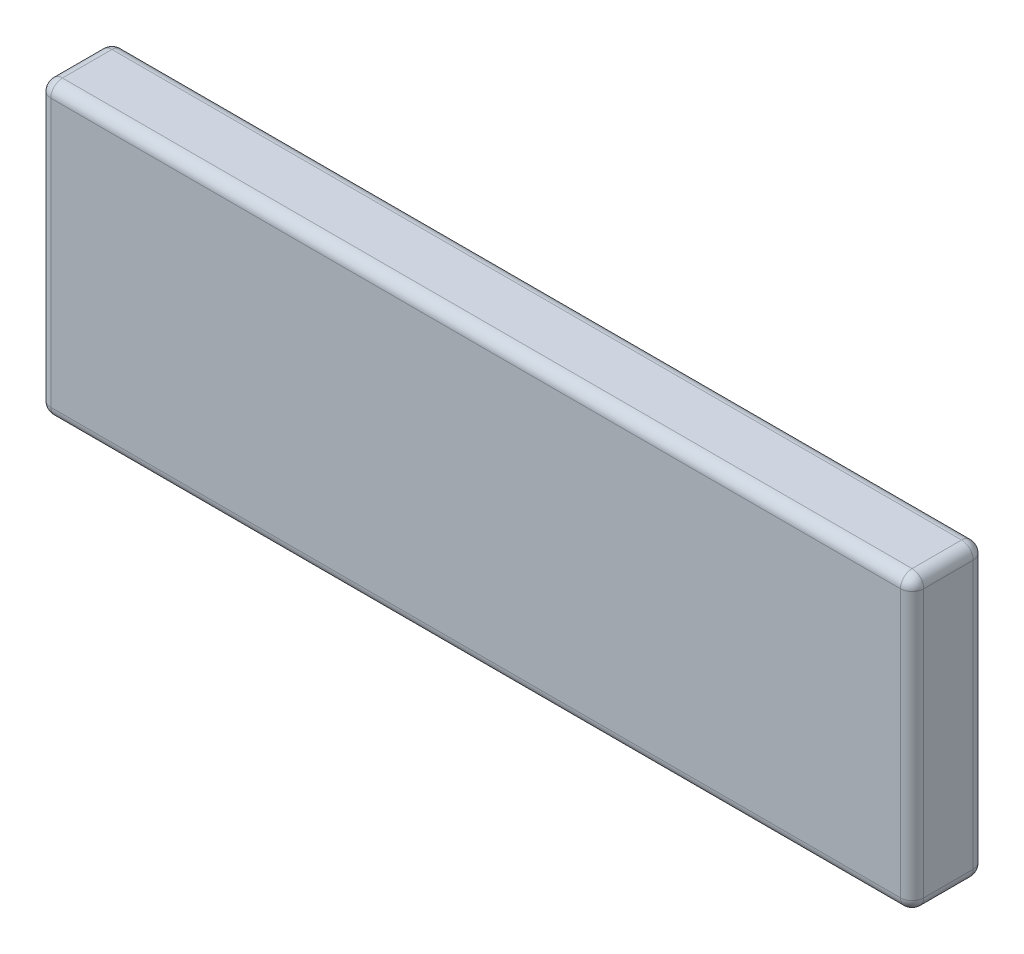
ISO-10303-21;
HEADER;
FILE_DESCRIPTION(('STEP AP214'),'2;1');
FILE_NAME('part.step','',(''),(''),'','','');
FILE_SCHEMA(('AUTOMOTIVE_DESIGN { 1 0 10303 214 1 1 1 1 }'));
ENDSEC;
DATA;
#1=APPLICATION_CONTEXT('core data for automotive mechanical design processes');
#2=APPLICATION_PROTOCOL_DEFINITION('international standard','automotive_design',2000,#1);
#3=PRODUCT_CONTEXT('',#1,'mechanical');
#4=PRODUCT('Part','Part','',(#3));
#5=PRODUCT_RELATED_PRODUCT_CATEGORY('part','',(#4));
#6=PRODUCT_DEFINITION_FORMATION('','',#4);
#7=PRODUCT_DEFINITION_CONTEXT('part definition',#1,'design');
#8=PRODUCT_DEFINITION('design','',#6,#7);
#9=PRODUCT_DEFINITION_SHAPE('','',#8);
#10=(LENGTH_UNIT() NAMED_UNIT(*) SI_UNIT(.MILLI.,.METRE.));
#11=(NAMED_UNIT(*) PLANE_ANGLE_UNIT() SI_UNIT($,.RADIAN.));
#12=(NAMED_UNIT(*) SI_UNIT($,.STERADIAN.) SOLID_ANGLE_UNIT());
#13=UNCERTAINTY_MEASURE_WITH_UNIT(LENGTH_MEASURE(1.E-05),#10,'distance_accuracy_value','');
#14=(GEOMETRIC_REPRESENTATION_CONTEXT(3) GLOBAL_UNCERTAINTY_ASSIGNED_CONTEXT((#13)) GLOBAL_UNIT_ASSIGNED_CONTEXT((#10,
#11,#12)) REPRESENTATION_CONTEXT('',''));
#15=CARTESIAN_POINT('',(0.,0.,0.));
#16=DIRECTION('',(0.,0.,1.));
#17=DIRECTION('',(1.,0.,0.));
#18=AXIS2_PLACEMENT_3D('',#15,#16,#17);
#19=CARTESIAN_POINT('',(9.52499999999999,-3.175,1.5875));
#20=DIRECTION('',(-1.,0.,0.));
#21=DIRECTION('',(0.,0.,1.));
#22=AXIS2_PLACEMENT_3D('',#19,#20,#21);
#23=PLANE('',#22);
#24=DIRECTION('',(0.,1.,0.));
#25=VECTOR('',#24,1.);
#26=CARTESIAN_POINT('',(9.52499999999999,-3.175,1.3335));
#27=LINE('',#26,#25);
#28=CARTESIAN_POINT('',(9.52499999999999,2.921,1.3335));
#29=VERTEX_POINT('',#28);
#30=CARTESIAN_POINT('',(9.52499999999999,-2.921,1.3335));
#31=VERTEX_POINT('',#30);
#32=EDGE_CURVE('E153',#29,#31,#27,.F.);
#33=ORIENTED_EDGE('',*,*,#32,.T.);
#34=DIRECTION('',(0.,0.,-1.));
#35=VECTOR('',#34,1.);
#36=CARTESIAN_POINT('',(9.52499999999999,-2.921,1.5875));
#37=LINE('',#36,#35);
#38=CARTESIAN_POINT('',(9.52499999999999,-2.921,0.254));
#39=VERTEX_POINT('',#38);
#40=EDGE_CURVE('E210',#31,#39,#37,.T.);
#41=ORIENTED_EDGE('',*,*,#40,.T.);
#42=DIRECTION('',(0.,1.,0.));
#43=VECTOR('',#42,1.);
#44=CARTESIAN_POINT('',(9.52499999999999,3.175,0.254));
#45=LINE('',#44,#43);
#46=CARTESIAN_POINT('',(9.52499999999999,2.921,0.254));
#47=VERTEX_POINT('',#46);
#48=EDGE_CURVE('E207',#39,#47,#45,.T.);
#49=ORIENTED_EDGE('',*,*,#48,.T.);
#50=DIRECTION('',(0.,0.,-1.));
#51=VECTOR('',#50,1.);
#52=CARTESIAN_POINT('',(9.52499999999999,2.921,1.5875));
#53=LINE('',#52,#51);
#54=EDGE_CURVE('E205',#47,#29,#53,.F.);
#55=ORIENTED_EDGE('',*,*,#54,.T.);
#56=EDGE_LOOP('',(#33,#41,#49,#55));
#57=FACE_BOUND('',#56,.T.);
#58=ADVANCED_FACE('F48',(#57),#23,.F.);
#59=CARTESIAN_POINT('',(-9.52500000000001,3.175,1.5875));
#60=DIRECTION('',(0.,-1.,0.));
#61=DIRECTION('',(0.,0.,-1.));
#62=AXIS2_PLACEMENT_3D('',#59,#60,#61);
#63=PLANE('',#62);
#64=DIRECTION('',(-1.,0.,0.));
#65=VECTOR('',#64,1.);
#66=CARTESIAN_POINT('',(-9.52500000000001,3.175,1.3335));
#67=LINE('',#66,#65);
#68=CARTESIAN_POINT('',(-9.271,3.175,1.3335));
#69=VERTEX_POINT('',#68);
#70=CARTESIAN_POINT('',(9.27099999999999,3.175,1.3335));
#71=VERTEX_POINT('',#70);
#72=EDGE_CURVE('E57',#69,#71,#67,.F.);
#73=ORIENTED_EDGE('',*,*,#72,.T.);
#74=DIRECTION('',(0.,0.,-1.));
#75=VECTOR('',#74,1.);
#76=CARTESIAN_POINT('',(9.27099999999999,3.175,1.5875));
#77=LINE('',#76,#75);
#78=CARTESIAN_POINT('',(9.27099999999999,3.175,0.254));
#79=VERTEX_POINT('',#78);
#80=EDGE_CURVE('E13',#71,#79,#77,.T.);
#81=ORIENTED_EDGE('',*,*,#80,.T.);
#82=DIRECTION('',(-1.,0.,0.));
#83=VECTOR('',#82,1.);
#84=CARTESIAN_POINT('',(-9.52500000000001,3.175,0.254));
#85=LINE('',#84,#83);
#86=CARTESIAN_POINT('',(-9.271,3.175,0.254));
#87=VERTEX_POINT('',#86);
#88=EDGE_CURVE('E213',#79,#87,#85,.T.);
#89=ORIENTED_EDGE('',*,*,#88,.T.);
#90=DIRECTION('',(0.,0.,-1.));
#91=VECTOR('',#90,1.);
#92=CARTESIAN_POINT('',(-9.271,3.175,1.5875));
#93=LINE('',#92,#91);
#94=EDGE_CURVE('E68',#87,#69,#93,.F.);
#95=ORIENTED_EDGE('',*,*,#94,.T.);
#96=EDGE_LOOP('',(#73,#81,#89,#95));
#97=FACE_BOUND('',#96,.T.);
#98=ADVANCED_FACE('F323',(#97),#63,.F.);
#99=CARTESIAN_POINT('',(-9.52500000000001,-3.175,1.5875));
#100=DIRECTION('',(1.,0.,0.));
#101=DIRECTION('',(0.,0.,-1.));
#102=AXIS2_PLACEMENT_3D('',#99,#100,#101);
#103=PLANE('',#102);
#104=DIRECTION('',(0.,-1.,0.));
#105=VECTOR('',#104,1.);
#106=CARTESIAN_POINT('',(-9.52500000000001,-3.175,0.254));
#107=LINE('',#106,#105);
#108=CARTESIAN_POINT('',(-9.52500000000001,2.921,0.254));
#109=VERTEX_POINT('',#108);
#110=CARTESIAN_POINT('',(-9.52500000000001,-2.921,0.254));
#111=VERTEX_POINT('',#110);
#112=EDGE_CURVE('E180',#109,#111,#107,.T.);
#113=ORIENTED_EDGE('',*,*,#112,.T.);
#114=DIRECTION('',(0.,0.,-1.));
#115=VECTOR('',#114,1.);
#116=CARTESIAN_POINT('',(-9.52500000000001,-2.921,1.5875));
#117=LINE('',#116,#115);
#118=CARTESIAN_POINT('',(-9.52500000000001,-2.921,1.3335));
#119=VERTEX_POINT('',#118);
#120=EDGE_CURVE('E185',#111,#119,#117,.F.);
#121=ORIENTED_EDGE('',*,*,#120,.T.);
#122=DIRECTION('',(0.,-1.,0.));
#123=VECTOR('',#122,1.);
#124=CARTESIAN_POINT('',(-9.52500000000001,-3.175,1.3335));
#125=LINE('',#124,#123);
#126=CARTESIAN_POINT('',(-9.52500000000001,2.921,1.3335));
#127=VERTEX_POINT('',#126);
#128=EDGE_CURVE('E182',#119,#127,#125,.F.);
#129=ORIENTED_EDGE('',*,*,#128,.T.);
#130=DIRECTION('',(0.,0.,-1.));
#131=VECTOR('',#130,1.);
#132=CARTESIAN_POINT('',(-9.52500000000001,2.921,1.5875));
#133=LINE('',#132,#131);
#134=EDGE_CURVE('E178',#127,#109,#133,.T.);
#135=ORIENTED_EDGE('',*,*,#134,.T.);
#136=EDGE_LOOP('',(#113,#121,#129,#135));
#137=FACE_BOUND('',#136,.T.);
#138=ADVANCED_FACE('F325',(#137),#103,.F.);
#139=CARTESIAN_POINT('',(-9.52500000000001,-3.175,1.5875));
#140=DIRECTION('',(0.,1.,0.));
#141=DIRECTION('',(0.,0.,1.));
#142=AXIS2_PLACEMENT_3D('',#139,#140,#141);
#143=PLANE('',#142);
#144=DIRECTION('',(1.,0.,0.));
#145=VECTOR('',#144,1.);
#146=CARTESIAN_POINT('',(-9.52500000000001,-3.175,1.3335));
#147=LINE('',#146,#145);
#148=CARTESIAN_POINT('',(9.27099999999999,-3.175,1.3335));
#149=VERTEX_POINT('',#148);
#150=CARTESIAN_POINT('',(-9.271,-3.175,1.3335));
#151=VERTEX_POINT('',#150);
#152=EDGE_CURVE('E200',#149,#151,#147,.F.);
#153=ORIENTED_EDGE('',*,*,#152,.T.);
#154=DIRECTION('',(0.,0.,-1.));
#155=VECTOR('',#154,1.);
#156=CARTESIAN_POINT('',(-9.271,-3.175,1.5875));
#157=LINE('',#156,#155);
#158=CARTESIAN_POINT('',(-9.271,-3.175,0.254));
#159=VERTEX_POINT('',#158);
#160=EDGE_CURVE('E202',#151,#159,#157,.T.);
#161=ORIENTED_EDGE('',*,*,#160,.T.);
#162=DIRECTION('',(1.,0.,0.));
#163=VECTOR('',#162,1.);
#164=CARTESIAN_POINT('',(9.52499999999999,-3.175,0.254));
#165=LINE('',#164,#163);
#166=CARTESIAN_POINT('',(9.27099999999999,-3.175,0.254));
#167=VERTEX_POINT('',#166);
#168=EDGE_CURVE('E198',#159,#167,#165,.T.);
#169=ORIENTED_EDGE('',*,*,#168,.T.);
#170=DIRECTION('',(0.,0.,-1.));
#171=VECTOR('',#170,1.);
#172=CARTESIAN_POINT('',(9.27099999999999,-3.175,1.5875));
#173=LINE('',#172,#171);
#174=EDGE_CURVE('E196',#167,#149,#173,.F.);
#175=ORIENTED_EDGE('',*,*,#174,.T.);
#176=EDGE_LOOP('',(#153,#161,#169,#175));
#177=FACE_BOUND('',#176,.T.);
#178=ADVANCED_FACE('F290',(#177),#143,.F.);
#179=CARTESIAN_POINT('',(0.,0.,1.5875));
#180=DIRECTION('',(0.,0.,-1.));
#181=DIRECTION('',(-1.,0.,0.));
#182=AXIS2_PLACEMENT_3D('',#179,#180,#181);
#183=PLANE('',#182);
#184=DIRECTION('',(-1.,0.,0.));
#185=VECTOR('',#184,1.);
#186=CARTESIAN_POINT('',(0.,2.921,1.5875));
#187=LINE('',#186,#185);
#188=CARTESIAN_POINT('',(9.27099999999999,2.921,1.5875));
#189=VERTEX_POINT('',#188);
#190=CARTESIAN_POINT('',(-9.271,2.921,1.5875));
#191=VERTEX_POINT('',#190);
#192=EDGE_CURVE('E140',#189,#191,#187,.T.);
#193=ORIENTED_EDGE('',*,*,#192,.T.);
#194=DIRECTION('',(0.,-1.,0.));
#195=VECTOR('',#194,1.);
#196=CARTESIAN_POINT('',(-9.271,0.,1.5875));
#197=LINE('',#196,#195);
#198=CARTESIAN_POINT('',(-9.271,-2.921,1.5875));
#199=VERTEX_POINT('',#198);
#200=EDGE_CURVE('E176',#191,#199,#197,.T.);
#201=ORIENTED_EDGE('',*,*,#200,.T.);
#202=DIRECTION('',(1.,0.,0.));
#203=VECTOR('',#202,1.);
#204=CARTESIAN_POINT('',(0.,-2.921,1.5875));
#205=LINE('',#204,#203);
#206=CARTESIAN_POINT('',(9.27099999999999,-2.921,1.5875));
#207=VERTEX_POINT('',#206);
#208=EDGE_CURVE('E143',#199,#207,#205,.T.);
#209=ORIENTED_EDGE('',*,*,#208,.T.);
#210=DIRECTION('',(0.,1.,0.));
#211=VECTOR('',#210,1.);
#212=CARTESIAN_POINT('',(9.27099999999999,0.,1.5875));
#213=LINE('',#212,#211);
#214=EDGE_CURVE('E135',#207,#189,#213,.T.);
#215=ORIENTED_EDGE('',*,*,#214,.T.);
#216=EDGE_LOOP('',(#193,#201,#209,#215));
#217=FACE_BOUND('',#216,.T.);
#218=ADVANCED_FACE('F137',(#217),#183,.F.);
#219=CARTESIAN_POINT('',(0.,0.,0.));
#220=DIRECTION('',(0.,0.,-1.));
#221=DIRECTION('',(-1.,0.,0.));
#222=AXIS2_PLACEMENT_3D('',#219,#220,#221);
#223=PLANE('',#222);
#224=DIRECTION('',(1.,0.,0.));
#225=VECTOR('',#224,1.);
#226=CARTESIAN_POINT('',(-9.52500000000001,-2.921,0.));
#227=LINE('',#226,#225);
#228=CARTESIAN_POINT('',(9.27099999999999,-2.921,0.));
#229=VERTEX_POINT('',#228);
#230=CARTESIAN_POINT('',(-9.271,-2.921,0.));
#231=VERTEX_POINT('',#230);
#232=EDGE_CURVE('E191',#229,#231,#227,.F.);
#233=ORIENTED_EDGE('',*,*,#232,.T.);
#234=DIRECTION('',(0.,-1.,0.));
#235=VECTOR('',#234,1.);
#236=CARTESIAN_POINT('',(-9.271,3.175,0.));
#237=LINE('',#236,#235);
#238=CARTESIAN_POINT('',(-9.271,2.921,0.));
#239=VERTEX_POINT('',#238);
#240=EDGE_CURVE('E193',#231,#239,#237,.F.);
#241=ORIENTED_EDGE('',*,*,#240,.T.);
#242=DIRECTION('',(-1.,0.,0.));
#243=VECTOR('',#242,1.);
#244=CARTESIAN_POINT('',(9.52499999999999,2.921,0.));
#245=LINE('',#244,#243);
#246=CARTESIAN_POINT('',(9.27099999999999,2.921,0.));
#247=VERTEX_POINT('',#246);
#248=EDGE_CURVE('E187',#239,#247,#245,.F.);
#249=ORIENTED_EDGE('',*,*,#248,.T.);
#250=DIRECTION('',(0.,1.,0.));
#251=VECTOR('',#250,1.);
#252=CARTESIAN_POINT('',(9.27099999999999,-3.175,0.));
#253=LINE('',#252,#251);
#254=EDGE_CURVE('E189',#247,#229,#253,.F.);
#255=ORIENTED_EDGE('',*,*,#254,.T.);
#256=EDGE_LOOP('',(#233,#241,#249,#255));
#257=FACE_BOUND('',#256,.T.);
#258=ADVANCED_FACE('F306',(#257),#223,.T.);
#259=CARTESIAN_POINT('',(9.27099999999999,-3.175,0.254));
#260=DIRECTION('',(0.,-1.,0.));
#261=DIRECTION('',(0.,0.,-1.));
#262=AXIS2_PLACEMENT_3D('',#259,#260,#261);
#263=CYLINDRICAL_SURFACE('',#262,0.254);
#264=CARTESIAN_POINT('',(9.27099999999999,2.921,0.254));
#265=DIRECTION('',(0.,1.,0.));
#266=DIRECTION('',(0.,0.,1.));
#267=AXIS2_PLACEMENT_3D('',#264,#265,#266);
#268=CIRCLE('',#267,0.254);
#269=EDGE_CURVE('E52',#47,#247,#268,.T.);
#270=ORIENTED_EDGE('',*,*,#269,.F.);
#271=ORIENTED_EDGE('',*,*,#48,.F.);
#272=CARTESIAN_POINT('',(9.27099999999999,-2.921,0.254));
#273=DIRECTION('',(0.,-1.,0.));
#274=DIRECTION('',(0.,0.,-1.));
#275=AXIS2_PLACEMENT_3D('',#272,#273,#274);
#276=CIRCLE('',#275,0.254);
#277=EDGE_CURVE('E173',#229,#39,#276,.T.);
#278=ORIENTED_EDGE('',*,*,#277,.F.);
#279=ORIENTED_EDGE('',*,*,#254,.F.);
#280=EDGE_LOOP('',(#270,#271,#278,#279));
#281=FACE_BOUND('',#280,.T.);
#282=ADVANCED_FACE('F50',(#281),#263,.T.);
#283=CARTESIAN_POINT('',(9.27099999999999,2.921,0.254));
#284=DIRECTION('',(0.,0.,1.));
#285=DIRECTION('',(1.,0.,0.));
#286=AXIS2_PLACEMENT_3D('',#283,#284,#285);
#287=SPHERICAL_SURFACE('',#286,0.254);
#288=CARTESIAN_POINT('',(9.27099999999999,2.921,0.254));
#289=DIRECTION('',(0.,0.,-1.));
#290=DIRECTION('',(-1.,0.,0.));
#291=AXIS2_PLACEMENT_3D('',#288,#289,#290);
#292=CIRCLE('',#291,0.254);
#293=EDGE_CURVE('E258',#47,#79,#292,.F.);
#294=ORIENTED_EDGE('',*,*,#293,.F.);
#295=ORIENTED_EDGE('',*,*,#269,.T.);
#296=CARTESIAN_POINT('',(9.27099999999999,2.921,0.254));
#297=DIRECTION('',(1.,0.,0.));
#298=DIRECTION('',(0.,0.,-1.));
#299=AXIS2_PLACEMENT_3D('',#296,#297,#298);
#300=CIRCLE('',#299,0.254);
#301=EDGE_CURVE('E261',#79,#247,#300,.F.);
#302=ORIENTED_EDGE('',*,*,#301,.F.);
#303=EDGE_LOOP('',(#294,#295,#302));
#304=FACE_BOUND('',#303,.T.);
#305=ADVANCED_FACE('F319',(#304),#287,.T.);
#306=CARTESIAN_POINT('',(9.27099999999999,-2.921,0.254));
#307=DIRECTION('',(0.,0.,1.));
#308=DIRECTION('',(1.,0.,0.));
#309=AXIS2_PLACEMENT_3D('',#306,#307,#308);
#310=SPHERICAL_SURFACE('',#309,0.254);
#311=CARTESIAN_POINT('',(9.27099999999999,-2.921,0.254));
#312=DIRECTION('',(1.,0.,0.));
#313=DIRECTION('',(0.,0.,-1.));
#314=AXIS2_PLACEMENT_3D('',#311,#312,#313);
#315=CIRCLE('',#314,0.254);
#316=EDGE_CURVE('E253',#229,#167,#315,.F.);
#317=ORIENTED_EDGE('',*,*,#316,.F.);
#318=ORIENTED_EDGE('',*,*,#277,.T.);
#319=CARTESIAN_POINT('',(9.27099999999999,-2.921,0.254));
#320=DIRECTION('',(0.,0.,-1.));
#321=DIRECTION('',(-1.,0.,0.));
#322=AXIS2_PLACEMENT_3D('',#319,#320,#321);
#323=CIRCLE('',#322,0.254);
#324=EDGE_CURVE('E256',#167,#39,#323,.F.);
#325=ORIENTED_EDGE('',*,*,#324,.F.);
#326=EDGE_LOOP('',(#317,#318,#325));
#327=FACE_BOUND('',#326,.T.);
#328=ADVANCED_FACE('F269',(#327),#310,.T.);
#329=CARTESIAN_POINT('',(-9.52500000000001,2.921,0.254));
#330=DIRECTION('',(1.,0.,0.));
#331=DIRECTION('',(0.,0.,-1.));
#332=AXIS2_PLACEMENT_3D('',#329,#330,#331);
#333=CYLINDRICAL_SURFACE('',#332,0.254);
#334=ORIENTED_EDGE('',*,*,#301,.T.);
#335=ORIENTED_EDGE('',*,*,#248,.F.);
#336=CARTESIAN_POINT('',(-9.271,2.921,0.254));
#337=DIRECTION('',(-1.,0.,0.));
#338=DIRECTION('',(0.,0.,1.));
#339=AXIS2_PLACEMENT_3D('',#336,#337,#338);
#340=CIRCLE('',#339,0.254);
#341=EDGE_CURVE('E248',#87,#239,#340,.T.);
#342=ORIENTED_EDGE('',*,*,#341,.F.);
#343=ORIENTED_EDGE('',*,*,#88,.F.);
#344=EDGE_LOOP('',(#334,#335,#342,#343));
#345=FACE_BOUND('',#344,.T.);
#346=ADVANCED_FACE('F316',(#345),#333,.T.);
#347=CARTESIAN_POINT('',(9.27099999999999,2.921,1.5875));
#348=DIRECTION('',(0.,0.,-1.));
#349=DIRECTION('',(-1.,0.,0.));
#350=AXIS2_PLACEMENT_3D('',#347,#348,#349);
#351=CYLINDRICAL_SURFACE('',#350,0.254);
#352=ORIENTED_EDGE('',*,*,#293,.T.);
#353=ORIENTED_EDGE('',*,*,#80,.F.);
#354=CARTESIAN_POINT('',(9.27099999999999,2.921,1.3335));
#355=DIRECTION('',(0.,0.,1.));
#356=DIRECTION('',(1.,0.,0.));
#357=AXIS2_PLACEMENT_3D('',#354,#355,#356);
#358=CIRCLE('',#357,0.254);
#359=EDGE_CURVE('E157',#29,#71,#358,.T.);
#360=ORIENTED_EDGE('',*,*,#359,.F.);
#361=ORIENTED_EDGE('',*,*,#54,.F.);
#362=EDGE_LOOP('',(#352,#353,#360,#361));
#363=FACE_BOUND('',#362,.T.);
#364=ADVANCED_FACE('F322',(#363),#351,.T.);
#365=CARTESIAN_POINT('',(9.27099999999999,0.,1.3335));
#366=DIRECTION('',(0.,1.,0.));
#367=DIRECTION('',(0.,0.,1.));
#368=AXIS2_PLACEMENT_3D('',#365,#366,#367);
#369=CYLINDRICAL_SURFACE('',#368,0.254);
#370=CARTESIAN_POINT('',(9.27099999999999,-2.921,1.3335));
#371=DIRECTION('',(0.,-1.,0.));
#372=DIRECTION('',(0.,0.,-1.));
#373=AXIS2_PLACEMENT_3D('',#370,#371,#372);
#374=CIRCLE('',#373,0.254);
#375=EDGE_CURVE('E158',#31,#207,#374,.T.);
#376=ORIENTED_EDGE('',*,*,#375,.F.);
#377=ORIENTED_EDGE('',*,*,#32,.F.);
#378=CARTESIAN_POINT('',(9.27099999999999,2.921,1.3335));
#379=DIRECTION('',(0.,1.,0.));
#380=DIRECTION('',(0.,0.,1.));
#381=AXIS2_PLACEMENT_3D('',#378,#379,#380);
#382=CIRCLE('',#381,0.254);
#383=EDGE_CURVE('E150',#189,#29,#382,.T.);
#384=ORIENTED_EDGE('',*,*,#383,.F.);
#385=ORIENTED_EDGE('',*,*,#214,.F.);
#386=EDGE_LOOP('',(#376,#377,#384,#385));
#387=FACE_BOUND('',#386,.T.);
#388=ADVANCED_FACE('F152',(#387),#369,.T.);
#389=CARTESIAN_POINT('',(9.27099999999999,-2.921,1.5875));
#390=DIRECTION('',(0.,0.,-1.));
#391=DIRECTION('',(-1.,0.,0.));
#392=AXIS2_PLACEMENT_3D('',#389,#390,#391);
#393=CYLINDRICAL_SURFACE('',#392,0.254);
#394=ORIENTED_EDGE('',*,*,#324,.T.);
#395=ORIENTED_EDGE('',*,*,#40,.F.);
#396=CARTESIAN_POINT('',(9.27099999999999,-2.921,1.3335));
#397=DIRECTION('',(0.,0.,1.));
#398=DIRECTION('',(1.,0.,0.));
#399=AXIS2_PLACEMENT_3D('',#396,#397,#398);
#400=CIRCLE('',#399,0.254);
#401=EDGE_CURVE('E243',#149,#31,#400,.T.);
#402=ORIENTED_EDGE('',*,*,#401,.F.);
#403=ORIENTED_EDGE('',*,*,#174,.F.);
#404=EDGE_LOOP('',(#394,#395,#402,#403));
#405=FACE_BOUND('',#404,.T.);
#406=ADVANCED_FACE('F280',(#405),#393,.T.);
#407=CARTESIAN_POINT('',(-9.52500000000001,-2.921,0.254));
#408=DIRECTION('',(-1.,0.,0.));
#409=DIRECTION('',(0.,0.,1.));
#410=AXIS2_PLACEMENT_3D('',#407,#408,#409);
#411=CYLINDRICAL_SURFACE('',#410,0.254);
#412=ORIENTED_EDGE('',*,*,#316,.T.);
#413=ORIENTED_EDGE('',*,*,#168,.F.);
#414=CARTESIAN_POINT('',(-9.271,-2.921,0.254));
#415=DIRECTION('',(-1.,0.,0.));
#416=DIRECTION('',(0.,0.,1.));
#417=AXIS2_PLACEMENT_3D('',#414,#415,#416);
#418=CIRCLE('',#417,0.254);
#419=EDGE_CURVE('E240',#231,#159,#418,.T.);
#420=ORIENTED_EDGE('',*,*,#419,.F.);
#421=ORIENTED_EDGE('',*,*,#232,.F.);
#422=EDGE_LOOP('',(#412,#413,#420,#421));
#423=FACE_BOUND('',#422,.T.);
#424=ADVANCED_FACE('F303',(#423),#411,.T.);
#425=CARTESIAN_POINT('',(-9.271,-3.175,0.254));
#426=DIRECTION('',(0.,1.,0.));
#427=DIRECTION('',(0.,0.,1.));
#428=AXIS2_PLACEMENT_3D('',#425,#426,#427);
#429=CYLINDRICAL_SURFACE('',#428,0.254);
#430=CARTESIAN_POINT('',(-9.271,2.921,0.254));
#431=DIRECTION('',(0.,1.,0.));
#432=DIRECTION('',(0.,0.,1.));
#433=AXIS2_PLACEMENT_3D('',#430,#431,#432);
#434=CIRCLE('',#433,0.254);
#435=EDGE_CURVE('E250',#239,#109,#434,.T.);
#436=ORIENTED_EDGE('',*,*,#435,.F.);
#437=ORIENTED_EDGE('',*,*,#240,.F.);
#438=CARTESIAN_POINT('',(-9.271,-2.921,0.254));
#439=DIRECTION('',(0.,-1.,0.));
#440=DIRECTION('',(0.,0.,-1.));
#441=AXIS2_PLACEMENT_3D('',#438,#439,#440);
#442=CIRCLE('',#441,0.254);
#443=EDGE_CURVE('E237',#111,#231,#442,.T.);
#444=ORIENTED_EDGE('',*,*,#443,.F.);
#445=ORIENTED_EDGE('',*,*,#112,.F.);
#446=EDGE_LOOP('',(#436,#437,#444,#445));
#447=FACE_BOUND('',#446,.T.);
#448=ADVANCED_FACE('F309',(#447),#429,.T.);
#449=CARTESIAN_POINT('',(-9.271,2.921,0.254));
#450=DIRECTION('',(0.,0.,1.));
#451=DIRECTION('',(1.,0.,0.));
#452=AXIS2_PLACEMENT_3D('',#449,#450,#451);
#453=SPHERICAL_SURFACE('',#452,0.254);
#454=ORIENTED_EDGE('',*,*,#341,.T.);
#455=ORIENTED_EDGE('',*,*,#435,.T.);
#456=CARTESIAN_POINT('',(-9.271,2.921,0.254));
#457=DIRECTION('',(0.,0.,-1.));
#458=DIRECTION('',(-1.,0.,0.));
#459=AXIS2_PLACEMENT_3D('',#456,#457,#458);
#460=CIRCLE('',#459,0.254);
#461=EDGE_CURVE('E164',#87,#109,#460,.F.);
#462=ORIENTED_EDGE('',*,*,#461,.F.);
#463=EDGE_LOOP('',(#454,#455,#462));
#464=FACE_BOUND('',#463,.T.);
#465=ADVANCED_FACE('F364',(#464),#453,.T.);
#466=CARTESIAN_POINT('',(9.27099999999999,2.921,1.3335));
#467=DIRECTION('',(0.,0.,1.));
#468=DIRECTION('',(1.,0.,0.));
#469=AXIS2_PLACEMENT_3D('',#466,#467,#468);
#470=SPHERICAL_SURFACE('',#469,0.254);
#471=ORIENTED_EDGE('',*,*,#383,.T.);
#472=ORIENTED_EDGE('',*,*,#359,.T.);
#473=CARTESIAN_POINT('',(9.27099999999999,2.921,1.3335));
#474=DIRECTION('',(1.,0.,0.));
#475=DIRECTION('',(0.,0.,-1.));
#476=AXIS2_PLACEMENT_3D('',#473,#474,#475);
#477=CIRCLE('',#476,0.254);
#478=EDGE_CURVE('E161',#189,#71,#477,.F.);
#479=ORIENTED_EDGE('',*,*,#478,.F.);
#480=EDGE_LOOP('',(#471,#472,#479));
#481=FACE_BOUND('',#480,.T.);
#482=ADVANCED_FACE('F162',(#481),#470,.T.);
#483=CARTESIAN_POINT('',(9.27099999999999,-2.921,1.3335));
#484=DIRECTION('',(0.,0.,1.));
#485=DIRECTION('',(1.,0.,0.));
#486=AXIS2_PLACEMENT_3D('',#483,#484,#485);
#487=SPHERICAL_SURFACE('',#486,0.254);
#488=ORIENTED_EDGE('',*,*,#401,.T.);
#489=ORIENTED_EDGE('',*,*,#375,.T.);
#490=CARTESIAN_POINT('',(9.27099999999999,-2.921,1.3335));
#491=DIRECTION('',(1.,0.,0.));
#492=DIRECTION('',(0.,0.,-1.));
#493=AXIS2_PLACEMENT_3D('',#490,#491,#492);
#494=CIRCLE('',#493,0.254);
#495=EDGE_CURVE('E165',#149,#207,#494,.F.);
#496=ORIENTED_EDGE('',*,*,#495,.F.);
#497=EDGE_LOOP('',(#488,#489,#496));
#498=FACE_BOUND('',#497,.T.);
#499=ADVANCED_FACE('F283',(#498),#487,.T.);
#500=CARTESIAN_POINT('',(-9.271,-2.921,0.254));
#501=DIRECTION('',(0.,0.,1.));
#502=DIRECTION('',(1.,0.,0.));
#503=AXIS2_PLACEMENT_3D('',#500,#501,#502);
#504=SPHERICAL_SURFACE('',#503,0.254);
#505=ORIENTED_EDGE('',*,*,#443,.T.);
#506=ORIENTED_EDGE('',*,*,#419,.T.);
#507=CARTESIAN_POINT('',(-9.271,-2.921,0.254));
#508=DIRECTION('',(0.,0.,-1.));
#509=DIRECTION('',(-1.,0.,0.));
#510=AXIS2_PLACEMENT_3D('',#507,#508,#509);
#511=CIRCLE('',#510,0.254);
#512=EDGE_CURVE('E231',#111,#159,#511,.F.);
#513=ORIENTED_EDGE('',*,*,#512,.F.);
#514=EDGE_LOOP('',(#505,#506,#513));
#515=FACE_BOUND('',#514,.T.);
#516=ADVANCED_FACE('F300',(#515),#504,.T.);
#517=CARTESIAN_POINT('',(-9.271,2.921,1.5875));
#518=DIRECTION('',(0.,0.,-1.));
#519=DIRECTION('',(-1.,0.,0.));
#520=AXIS2_PLACEMENT_3D('',#517,#518,#519);
#521=CYLINDRICAL_SURFACE('',#520,0.254);
#522=ORIENTED_EDGE('',*,*,#461,.T.);
#523=ORIENTED_EDGE('',*,*,#134,.F.);
#524=CARTESIAN_POINT('',(-9.271,2.921,1.3335));
#525=DIRECTION('',(0.,0.,1.));
#526=DIRECTION('',(1.,0.,0.));
#527=AXIS2_PLACEMENT_3D('',#524,#525,#526);
#528=CIRCLE('',#527,0.254);
#529=EDGE_CURVE('E228',#69,#127,#528,.T.);
#530=ORIENTED_EDGE('',*,*,#529,.F.);
#531=ORIENTED_EDGE('',*,*,#94,.F.);
#532=EDGE_LOOP('',(#522,#523,#530,#531));
#533=FACE_BOUND('',#532,.T.);
#534=ADVANCED_FACE('F354',(#533),#521,.T.);
#535=CARTESIAN_POINT('',(0.,2.921,1.3335));
#536=DIRECTION('',(-1.,0.,0.));
#537=DIRECTION('',(0.,0.,1.));
#538=AXIS2_PLACEMENT_3D('',#535,#536,#537);
#539=CYLINDRICAL_SURFACE('',#538,0.254);
#540=ORIENTED_EDGE('',*,*,#478,.T.);
#541=ORIENTED_EDGE('',*,*,#72,.F.);
#542=CARTESIAN_POINT('',(-9.271,2.921,1.3335));
#543=DIRECTION('',(-1.,0.,0.));
#544=DIRECTION('',(0.,0.,1.));
#545=AXIS2_PLACEMENT_3D('',#542,#543,#544);
#546=CIRCLE('',#545,0.254);
#547=EDGE_CURVE('E169',#191,#69,#546,.T.);
#548=ORIENTED_EDGE('',*,*,#547,.F.);
#549=ORIENTED_EDGE('',*,*,#192,.F.);
#550=EDGE_LOOP('',(#540,#541,#548,#549));
#551=FACE_BOUND('',#550,.T.);
#552=ADVANCED_FACE('F167',(#551),#539,.T.);
#553=CARTESIAN_POINT('',(0.,-2.921,1.3335));
#554=DIRECTION('',(1.,0.,0.));
#555=DIRECTION('',(0.,0.,-1.));
#556=AXIS2_PLACEMENT_3D('',#553,#554,#555);
#557=CYLINDRICAL_SURFACE('',#556,0.254);
#558=ORIENTED_EDGE('',*,*,#495,.T.);
#559=ORIENTED_EDGE('',*,*,#208,.F.);
#560=CARTESIAN_POINT('',(-9.271,-2.921,1.3335));
#561=DIRECTION('',(-1.,0.,0.));
#562=DIRECTION('',(0.,0.,1.));
#563=AXIS2_PLACEMENT_3D('',#560,#561,#562);
#564=CIRCLE('',#563,0.254);
#565=EDGE_CURVE('E224',#151,#199,#564,.T.);
#566=ORIENTED_EDGE('',*,*,#565,.F.);
#567=ORIENTED_EDGE('',*,*,#152,.F.);
#568=EDGE_LOOP('',(#558,#559,#566,#567));
#569=FACE_BOUND('',#568,.T.);
#570=ADVANCED_FACE('F287',(#569),#557,.T.);
#571=CARTESIAN_POINT('',(-9.271,-2.921,1.5875));
#572=DIRECTION('',(0.,0.,-1.));
#573=DIRECTION('',(-1.,0.,0.));
#574=AXIS2_PLACEMENT_3D('',#571,#572,#573);
#575=CYLINDRICAL_SURFACE('',#574,0.254);
#576=ORIENTED_EDGE('',*,*,#512,.T.);
#577=ORIENTED_EDGE('',*,*,#160,.F.);
#578=CARTESIAN_POINT('',(-9.271,-2.921,1.3335));
#579=DIRECTION('',(0.,0.,1.));
#580=DIRECTION('',(1.,0.,0.));
#581=AXIS2_PLACEMENT_3D('',#578,#579,#580);
#582=CIRCLE('',#581,0.254);
#583=EDGE_CURVE('E221',#119,#151,#582,.T.);
#584=ORIENTED_EDGE('',*,*,#583,.F.);
#585=ORIENTED_EDGE('',*,*,#120,.F.);
#586=EDGE_LOOP('',(#576,#577,#584,#585));
#587=FACE_BOUND('',#586,.T.);
#588=ADVANCED_FACE('F293',(#587),#575,.T.);
#589=CARTESIAN_POINT('',(-9.271,2.921,1.3335));
#590=DIRECTION('',(0.,0.,1.));
#591=DIRECTION('',(1.,0.,0.));
#592=AXIS2_PLACEMENT_3D('',#589,#590,#591);
#593=SPHERICAL_SURFACE('',#592,0.254);
#594=ORIENTED_EDGE('',*,*,#547,.T.);
#595=ORIENTED_EDGE('',*,*,#529,.T.);
#596=CARTESIAN_POINT('',(-9.271,2.921,1.3335));
#597=DIRECTION('',(0.,1.,0.));
#598=DIRECTION('',(0.,0.,1.));
#599=AXIS2_PLACEMENT_3D('',#596,#597,#598);
#600=CIRCLE('',#599,0.254);
#601=EDGE_CURVE('E219',#191,#127,#600,.F.);
#602=ORIENTED_EDGE('',*,*,#601,.F.);
#603=EDGE_LOOP('',(#594,#595,#602));
#604=FACE_BOUND('',#603,.T.);
#605=ADVANCED_FACE('F343',(#604),#593,.T.);
#606=CARTESIAN_POINT('',(-9.271,-2.921,1.3335));
#607=DIRECTION('',(0.,0.,1.));
#608=DIRECTION('',(1.,0.,0.));
#609=AXIS2_PLACEMENT_3D('',#606,#607,#608);
#610=SPHERICAL_SURFACE('',#609,0.254);
#611=ORIENTED_EDGE('',*,*,#583,.T.);
#612=ORIENTED_EDGE('',*,*,#565,.T.);
#613=CARTESIAN_POINT('',(-9.271,-2.921,1.3335));
#614=DIRECTION('',(0.,-1.,0.));
#615=DIRECTION('',(0.,0.,-1.));
#616=AXIS2_PLACEMENT_3D('',#613,#614,#615);
#617=CIRCLE('',#616,0.254);
#618=EDGE_CURVE('E217',#119,#199,#617,.F.);
#619=ORIENTED_EDGE('',*,*,#618,.F.);
#620=EDGE_LOOP('',(#611,#612,#619));
#621=FACE_BOUND('',#620,.T.);
#622=ADVANCED_FACE('F339',(#621),#610,.T.);
#623=CARTESIAN_POINT('',(-9.271,0.,1.3335));
#624=DIRECTION('',(0.,-1.,0.));
#625=DIRECTION('',(0.,0.,-1.));
#626=AXIS2_PLACEMENT_3D('',#623,#624,#625);
#627=CYLINDRICAL_SURFACE('',#626,0.254);
#628=ORIENTED_EDGE('',*,*,#601,.T.);
#629=ORIENTED_EDGE('',*,*,#128,.F.);
#630=ORIENTED_EDGE('',*,*,#618,.T.);
#631=ORIENTED_EDGE('',*,*,#200,.F.);
#632=EDGE_LOOP('',(#628,#629,#630,#631));
#633=FACE_BOUND('',#632,.T.);
#634=ADVANCED_FACE('F336',(#633),#627,.T.);
#635=CLOSED_SHELL('',(#58,#98,#138,#178,#218,#258,#282,#305,#328,#346,#364,#388,#406,#424,#448,
#465,#482,#499,#516,#534,#552,#570,#588,#605,#622,#634));
#636=MANIFOLD_SOLID_BREP('B2',#635);
#637=ADVANCED_BREP_SHAPE_REPRESENTATION('',(#18,#636),#14);
#638=SHAPE_DEFINITION_REPRESENTATION(#9,#637);
ENDSEC;
END-ISO-10303-21;
